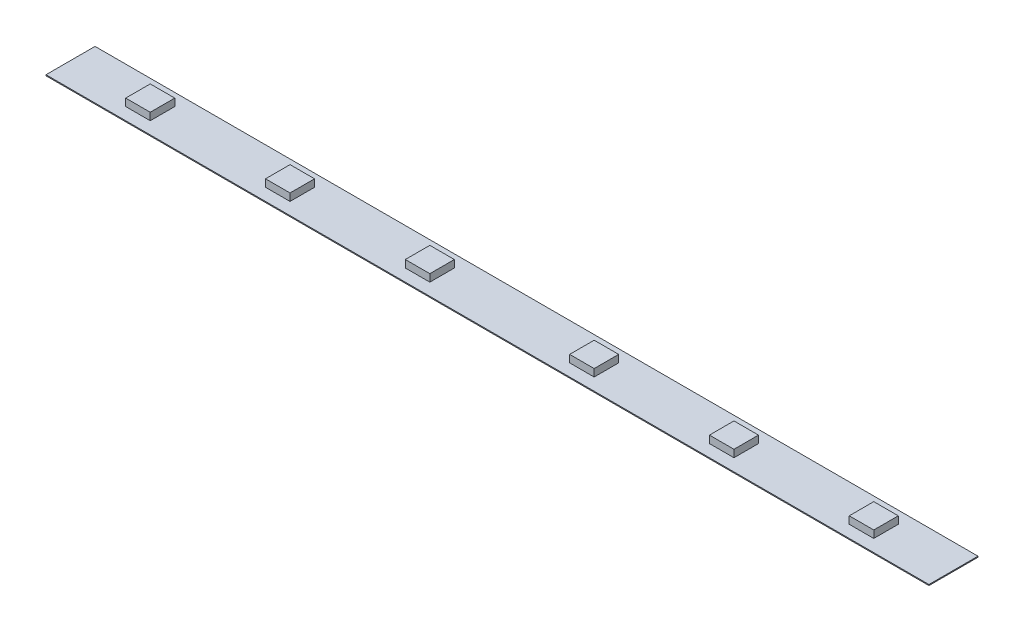
ISO-10303-21;
HEADER;
FILE_DESCRIPTION(('STEP AP214'),'2;1');
FILE_NAME('part.step','',(''),(''),'','','');
FILE_SCHEMA(('AUTOMOTIVE_DESIGN { 1 0 10303 214 1 1 1 1 }'));
ENDSEC;
DATA;
#1=APPLICATION_CONTEXT('core data for automotive mechanical design processes');
#2=APPLICATION_PROTOCOL_DEFINITION('international standard','automotive_design',2000,#1);
#3=PRODUCT_CONTEXT('',#1,'mechanical');
#4=PRODUCT('Part','Part','',(#3));
#5=PRODUCT_RELATED_PRODUCT_CATEGORY('part','',(#4));
#6=PRODUCT_DEFINITION_FORMATION('','',#4);
#7=PRODUCT_DEFINITION_CONTEXT('part definition',#1,'design');
#8=PRODUCT_DEFINITION('design','',#6,#7);
#9=PRODUCT_DEFINITION_SHAPE('','',#8);
#10=(LENGTH_UNIT() NAMED_UNIT(*) SI_UNIT(.MILLI.,.METRE.));
#11=(NAMED_UNIT(*) PLANE_ANGLE_UNIT() SI_UNIT($,.RADIAN.));
#12=(NAMED_UNIT(*) SI_UNIT($,.STERADIAN.) SOLID_ANGLE_UNIT());
#13=UNCERTAINTY_MEASURE_WITH_UNIT(LENGTH_MEASURE(1.E-05),#10,'distance_accuracy_value','');
#14=(GEOMETRIC_REPRESENTATION_CONTEXT(3) GLOBAL_UNCERTAINTY_ASSIGNED_CONTEXT((#13)) GLOBAL_UNIT_ASSIGNED_CONTEXT((#10,
#11,#12)) REPRESENTATION_CONTEXT('',''));
#15=CARTESIAN_POINT('',(0.,0.,0.));
#16=DIRECTION('',(0.,0.,1.));
#17=DIRECTION('',(1.,0.,0.));
#18=AXIS2_PLACEMENT_3D('',#15,#16,#17);
#19=CARTESIAN_POINT('',(0.,0.2,0.));
#20=DIRECTION('',(0.,-1.,0.));
#21=DIRECTION('',(0.,0.,-1.));
#22=AXIS2_PLACEMENT_3D('',#19,#20,#21);
#23=PLANE('',#22);
#24=DIRECTION('',(-1.,0.,0.));
#25=VECTOR('',#24,1.);
#26=CARTESIAN_POINT('',(-71.25,0.2,-2.5));
#27=LINE('',#26,#25);
#28=CARTESIAN_POINT('',(-71.25,0.2,-2.5));
#29=VERTEX_POINT('',#28);
#30=CARTESIAN_POINT('',(-76.25,0.2,-2.5));
#31=VERTEX_POINT('',#30);
#32=EDGE_CURVE('E240',#29,#31,#27,.T.);
#33=ORIENTED_EDGE('',*,*,#32,.F.);
#34=DIRECTION('',(0.,0.,-1.));
#35=VECTOR('',#34,1.);
#36=CARTESIAN_POINT('',(-71.25,0.2,-2.5));
#37=LINE('',#36,#35);
#38=CARTESIAN_POINT('',(-71.25,0.2,2.5));
#39=VERTEX_POINT('',#38);
#40=EDGE_CURVE('E253',#39,#29,#37,.T.);
#41=ORIENTED_EDGE('',*,*,#40,.F.);
#42=DIRECTION('',(1.,0.,0.));
#43=VECTOR('',#42,1.);
#44=CARTESIAN_POINT('',(-71.25,0.2,2.5));
#45=LINE('',#44,#43);
#46=CARTESIAN_POINT('',(-76.25,0.2,2.5));
#47=VERTEX_POINT('',#46);
#48=EDGE_CURVE('E262',#47,#39,#45,.T.);
#49=ORIENTED_EDGE('',*,*,#48,.F.);
#50=DIRECTION('',(0.,0.,1.));
#51=VECTOR('',#50,1.);
#52=CARTESIAN_POINT('',(-76.25,0.2,-2.5));
#53=LINE('',#52,#51);
#54=EDGE_CURVE('E243',#31,#47,#53,.T.);
#55=ORIENTED_EDGE('',*,*,#54,.F.);
#56=EDGE_LOOP('',(#33,#41,#49,#55));
#57=FACE_BOUND('',#56,.T.);
#58=DIRECTION('',(0.,0.,-1.));
#59=VECTOR('',#58,1.);
#60=CARTESIAN_POINT('',(76.25,0.2,-2.5));
#61=LINE('',#60,#59);
#62=CARTESIAN_POINT('',(76.25,0.2,2.5));
#63=VERTEX_POINT('',#62);
#64=CARTESIAN_POINT('',(76.25,0.2,-2.5));
#65=VERTEX_POINT('',#64);
#66=EDGE_CURVE('E311',#63,#65,#61,.T.);
#67=ORIENTED_EDGE('',*,*,#66,.F.);
#68=DIRECTION('',(1.,0.,0.));
#69=VECTOR('',#68,1.);
#70=CARTESIAN_POINT('',(71.25,0.2,2.5));
#71=LINE('',#70,#69);
#72=CARTESIAN_POINT('',(71.25,0.2,2.5));
#73=VERTEX_POINT('',#72);
#74=EDGE_CURVE('E316',#73,#63,#71,.T.);
#75=ORIENTED_EDGE('',*,*,#74,.F.);
#76=DIRECTION('',(0.,0.,1.));
#77=VECTOR('',#76,1.);
#78=CARTESIAN_POINT('',(71.25,0.2,-2.5));
#79=LINE('',#78,#77);
#80=CARTESIAN_POINT('',(71.25,0.2,-2.5));
#81=VERTEX_POINT('',#80);
#82=EDGE_CURVE('E328',#81,#73,#79,.T.);
#83=ORIENTED_EDGE('',*,*,#82,.F.);
#84=DIRECTION('',(-1.,0.,0.));
#85=VECTOR('',#84,1.);
#86=CARTESIAN_POINT('',(71.25,0.2,-2.5));
#87=LINE('',#86,#85);
#88=EDGE_CURVE('E325',#65,#81,#87,.T.);
#89=ORIENTED_EDGE('',*,*,#88,.F.);
#90=EDGE_LOOP('',(#67,#75,#83,#89));
#91=FACE_BOUND('',#90,.T.);
#92=DIRECTION('',(0.,0.,-1.));
#93=VECTOR('',#92,1.);
#94=CARTESIAN_POINT('',(19.25,0.2,-2.5));
#95=LINE('',#94,#93);
#96=CARTESIAN_POINT('',(19.25,0.2,2.5));
#97=VERTEX_POINT('',#96);
#98=CARTESIAN_POINT('',(19.25,0.2,-2.5));
#99=VERTEX_POINT('',#98);
#100=EDGE_CURVE('E377',#97,#99,#95,.T.);
#101=ORIENTED_EDGE('',*,*,#100,.F.);
#102=DIRECTION('',(1.,0.,0.));
#103=VECTOR('',#102,1.);
#104=CARTESIAN_POINT('',(14.25,0.2,2.5));
#105=LINE('',#104,#103);
#106=CARTESIAN_POINT('',(14.25,0.2,2.5));
#107=VERTEX_POINT('',#106);
#108=EDGE_CURVE('E382',#107,#97,#105,.T.);
#109=ORIENTED_EDGE('',*,*,#108,.F.);
#110=DIRECTION('',(0.,0.,1.));
#111=VECTOR('',#110,1.);
#112=CARTESIAN_POINT('',(14.25,0.2,-2.5));
#113=LINE('',#112,#111);
#114=CARTESIAN_POINT('',(14.25,0.2,-2.5));
#115=VERTEX_POINT('',#114);
#116=EDGE_CURVE('E394',#115,#107,#113,.T.);
#117=ORIENTED_EDGE('',*,*,#116,.F.);
#118=DIRECTION('',(-1.,0.,0.));
#119=VECTOR('',#118,1.);
#120=CARTESIAN_POINT('',(14.25,0.2,-2.5));
#121=LINE('',#120,#119);
#122=EDGE_CURVE('E391',#99,#115,#121,.T.);
#123=ORIENTED_EDGE('',*,*,#122,.F.);
#124=EDGE_LOOP('',(#101,#109,#117,#123));
#125=FACE_BOUND('',#124,.T.);
#126=DIRECTION('',(0.,0.,-1.));
#127=VECTOR('',#126,1.);
#128=CARTESIAN_POINT('',(90.,0.2,5.));
#129=LINE('',#128,#127);
#130=CARTESIAN_POINT('',(90.,0.2,5.));
#131=VERTEX_POINT('',#130);
#132=CARTESIAN_POINT('',(90.,0.2,-5.));
#133=VERTEX_POINT('',#132);
#134=EDGE_CURVE('E411',#131,#133,#129,.T.);
#135=ORIENTED_EDGE('',*,*,#134,.T.);
#136=DIRECTION('',(-1.,0.,0.));
#137=VECTOR('',#136,1.);
#138=CARTESIAN_POINT('',(-90.,0.2,-5.));
#139=LINE('',#138,#137);
#140=CARTESIAN_POINT('',(-90.,0.2,-5.));
#141=VERTEX_POINT('',#140);
#142=EDGE_CURVE('E414',#133,#141,#139,.T.);
#143=ORIENTED_EDGE('',*,*,#142,.T.);
#144=DIRECTION('',(0.,0.,1.));
#145=VECTOR('',#144,1.);
#146=CARTESIAN_POINT('',(-90.,0.2,5.));
#147=LINE('',#146,#145);
#148=CARTESIAN_POINT('',(-90.,0.2,5.));
#149=VERTEX_POINT('',#148);
#150=EDGE_CURVE('E417',#141,#149,#147,.T.);
#151=ORIENTED_EDGE('',*,*,#150,.T.);
#152=DIRECTION('',(1.,0.,0.));
#153=VECTOR('',#152,1.);
#154=CARTESIAN_POINT('',(-90.,0.2,5.));
#155=LINE('',#154,#153);
#156=EDGE_CURVE('E419',#149,#131,#155,.T.);
#157=ORIENTED_EDGE('',*,*,#156,.T.);
#158=EDGE_LOOP('',(#135,#143,#151,#157));
#159=FACE_BOUND('',#158,.T.);
#160=DIRECTION('',(0.,0.,-1.));
#161=VECTOR('',#160,1.);
#162=CARTESIAN_POINT('',(47.75,0.2,-2.5));
#163=LINE('',#162,#161);
#164=CARTESIAN_POINT('',(47.75,0.2,2.5));
#165=VERTEX_POINT('',#164);
#166=CARTESIAN_POINT('',(47.75,0.2,-2.5));
#167=VERTEX_POINT('',#166);
#168=EDGE_CURVE('E344',#165,#167,#163,.T.);
#169=ORIENTED_EDGE('',*,*,#168,.F.);
#170=DIRECTION('',(1.,0.,0.));
#171=VECTOR('',#170,1.);
#172=CARTESIAN_POINT('',(42.75,0.2,2.5));
#173=LINE('',#172,#171);
#174=CARTESIAN_POINT('',(42.75,0.2,2.5));
#175=VERTEX_POINT('',#174);
#176=EDGE_CURVE('E349',#175,#165,#173,.T.);
#177=ORIENTED_EDGE('',*,*,#176,.F.);
#178=DIRECTION('',(0.,0.,1.));
#179=VECTOR('',#178,1.);
#180=CARTESIAN_POINT('',(42.75,0.2,-2.5));
#181=LINE('',#180,#179);
#182=CARTESIAN_POINT('',(42.75,0.2,-2.5));
#183=VERTEX_POINT('',#182);
#184=EDGE_CURVE('E361',#183,#175,#181,.T.);
#185=ORIENTED_EDGE('',*,*,#184,.F.);
#186=DIRECTION('',(-1.,0.,0.));
#187=VECTOR('',#186,1.);
#188=CARTESIAN_POINT('',(42.75,0.2,-2.5));
#189=LINE('',#188,#187);
#190=EDGE_CURVE('E358',#167,#183,#189,.T.);
#191=ORIENTED_EDGE('',*,*,#190,.F.);
#192=EDGE_LOOP('',(#169,#177,#185,#191));
#193=FACE_BOUND('',#192,.T.);
#194=DIRECTION('',(0.,0.,-1.));
#195=VECTOR('',#194,1.);
#196=CARTESIAN_POINT('',(-14.25,0.2,-2.5));
#197=LINE('',#196,#195);
#198=CARTESIAN_POINT('',(-14.25,0.2,2.5));
#199=VERTEX_POINT('',#198);
#200=CARTESIAN_POINT('',(-14.25,0.2,-2.5));
#201=VERTEX_POINT('',#200);
#202=EDGE_CURVE('E278',#199,#201,#197,.T.);
#203=ORIENTED_EDGE('',*,*,#202,.F.);
#204=DIRECTION('',(1.,0.,0.));
#205=VECTOR('',#204,1.);
#206=CARTESIAN_POINT('',(-14.25,0.2,2.5));
#207=LINE('',#206,#205);
#208=CARTESIAN_POINT('',(-19.25,0.2,2.5));
#209=VERTEX_POINT('',#208);
#210=EDGE_CURVE('E283',#209,#199,#207,.T.);
#211=ORIENTED_EDGE('',*,*,#210,.F.);
#212=DIRECTION('',(0.,0.,1.));
#213=VECTOR('',#212,1.);
#214=CARTESIAN_POINT('',(-19.25,0.2,-2.5));
#215=LINE('',#214,#213);
#216=CARTESIAN_POINT('',(-19.25,0.2,-2.5));
#217=VERTEX_POINT('',#216);
#218=EDGE_CURVE('E295',#217,#209,#215,.T.);
#219=ORIENTED_EDGE('',*,*,#218,.F.);
#220=DIRECTION('',(-1.,0.,0.));
#221=VECTOR('',#220,1.);
#222=CARTESIAN_POINT('',(-14.25,0.2,-2.5));
#223=LINE('',#222,#221);
#224=EDGE_CURVE('E292',#201,#217,#223,.T.);
#225=ORIENTED_EDGE('',*,*,#224,.F.);
#226=EDGE_LOOP('',(#203,#211,#219,#225));
#227=FACE_BOUND('',#226,.T.);
#228=DIRECTION('',(-1.,0.,0.));
#229=VECTOR('',#228,1.);
#230=CARTESIAN_POINT('',(-42.75,0.2,-2.5));
#231=LINE('',#230,#229);
#232=CARTESIAN_POINT('',(-42.75,0.2,-2.5));
#233=VERTEX_POINT('',#232);
#234=CARTESIAN_POINT('',(-47.75,0.2,-2.5));
#235=VERTEX_POINT('',#234);
#236=EDGE_CURVE('E239',#233,#235,#231,.T.);
#237=ORIENTED_EDGE('',*,*,#236,.F.);
#238=DIRECTION('',(0.,0.,-1.));
#239=VECTOR('',#238,1.);
#240=CARTESIAN_POINT('',(-42.75,0.2,-2.5));
#241=LINE('',#240,#239);
#242=CARTESIAN_POINT('',(-42.75,0.2,2.5));
#243=VERTEX_POINT('',#242);
#244=EDGE_CURVE('E236',#243,#233,#241,.T.);
#245=ORIENTED_EDGE('',*,*,#244,.F.);
#246=DIRECTION('',(1.,0.,0.));
#247=VECTOR('',#246,1.);
#248=CARTESIAN_POINT('',(-42.75,0.2,2.5));
#249=LINE('',#248,#247);
#250=CARTESIAN_POINT('',(-47.75,0.2,2.5));
#251=VERTEX_POINT('',#250);
#252=EDGE_CURVE('E54',#251,#243,#249,.T.);
#253=ORIENTED_EDGE('',*,*,#252,.F.);
#254=DIRECTION('',(0.,0.,1.));
#255=VECTOR('',#254,1.);
#256=CARTESIAN_POINT('',(-47.75,0.2,-2.5));
#257=LINE('',#256,#255);
#258=EDGE_CURVE('E49',#235,#251,#257,.T.);
#259=ORIENTED_EDGE('',*,*,#258,.F.);
#260=EDGE_LOOP('',(#237,#245,#253,#259));
#261=FACE_BOUND('',#260,.T.);
#262=ADVANCED_FACE('F34',(#57,#91,#125,#159,#193,#227,#261),#23,.F.);
#263=CARTESIAN_POINT('',(90.,0.2,5.));
#264=DIRECTION('',(-1.,0.,0.));
#265=DIRECTION('',(0.,0.,1.));
#266=AXIS2_PLACEMENT_3D('',#263,#264,#265);
#267=PLANE('',#266);
#268=DIRECTION('',(0.,0.,-1.));
#269=VECTOR('',#268,1.);
#270=CARTESIAN_POINT('',(90.,0.,5.));
#271=LINE('',#270,#269);
#272=CARTESIAN_POINT('',(90.,0.,5.));
#273=VERTEX_POINT('',#272);
#274=CARTESIAN_POINT('',(90.,0.,-5.));
#275=VERTEX_POINT('',#274);
#276=EDGE_CURVE('E410',#273,#275,#271,.T.);
#277=ORIENTED_EDGE('',*,*,#276,.T.);
#278=DIRECTION('',(0.,-1.,0.));
#279=VECTOR('',#278,1.);
#280=CARTESIAN_POINT('',(90.,0.2,-5.));
#281=LINE('',#280,#279);
#282=EDGE_CURVE('E11',#133,#275,#281,.T.);
#283=ORIENTED_EDGE('',*,*,#282,.F.);
#284=ORIENTED_EDGE('',*,*,#134,.F.);
#285=DIRECTION('',(0.,-1.,0.));
#286=VECTOR('',#285,1.);
#287=CARTESIAN_POINT('',(90.,0.2,5.));
#288=LINE('',#287,#286);
#289=EDGE_CURVE('E421',#131,#273,#288,.T.);
#290=ORIENTED_EDGE('',*,*,#289,.T.);
#291=EDGE_LOOP('',(#277,#283,#284,#290));
#292=FACE_BOUND('',#291,.T.);
#293=ADVANCED_FACE('F36',(#292),#267,.F.);
#294=CARTESIAN_POINT('',(-90.,0.2,-5.));
#295=DIRECTION('',(0.,0.,1.));
#296=DIRECTION('',(1.,0.,0.));
#297=AXIS2_PLACEMENT_3D('',#294,#295,#296);
#298=PLANE('',#297);
#299=DIRECTION('',(-1.,0.,0.));
#300=VECTOR('',#299,1.);
#301=CARTESIAN_POINT('',(-90.,0.,-5.));
#302=LINE('',#301,#300);
#303=CARTESIAN_POINT('',(-90.,0.,-5.));
#304=VERTEX_POINT('',#303);
#305=EDGE_CURVE('E424',#275,#304,#302,.T.);
#306=ORIENTED_EDGE('',*,*,#305,.T.);
#307=DIRECTION('',(0.,-1.,0.));
#308=VECTOR('',#307,1.);
#309=CARTESIAN_POINT('',(-90.,0.2,-5.));
#310=LINE('',#309,#308);
#311=EDGE_CURVE('E42',#141,#304,#310,.T.);
#312=ORIENTED_EDGE('',*,*,#311,.F.);
#313=ORIENTED_EDGE('',*,*,#142,.F.);
#314=ORIENTED_EDGE('',*,*,#282,.T.);
#315=EDGE_LOOP('',(#306,#312,#313,#314));
#316=FACE_BOUND('',#315,.T.);
#317=ADVANCED_FACE('F454',(#316),#298,.F.);
#318=CARTESIAN_POINT('',(-90.,0.2,5.));
#319=DIRECTION('',(1.,0.,0.));
#320=DIRECTION('',(0.,0.,-1.));
#321=AXIS2_PLACEMENT_3D('',#318,#319,#320);
#322=PLANE('',#321);
#323=DIRECTION('',(0.,0.,1.));
#324=VECTOR('',#323,1.);
#325=CARTESIAN_POINT('',(-90.,0.,5.));
#326=LINE('',#325,#324);
#327=CARTESIAN_POINT('',(-90.,0.,5.));
#328=VERTEX_POINT('',#327);
#329=EDGE_CURVE('E426',#304,#328,#326,.T.);
#330=ORIENTED_EDGE('',*,*,#329,.T.);
#331=DIRECTION('',(0.,-1.,0.));
#332=VECTOR('',#331,1.);
#333=CARTESIAN_POINT('',(-90.,0.2,5.));
#334=LINE('',#333,#332);
#335=EDGE_CURVE('E431',#149,#328,#334,.T.);
#336=ORIENTED_EDGE('',*,*,#335,.F.);
#337=ORIENTED_EDGE('',*,*,#150,.F.);
#338=ORIENTED_EDGE('',*,*,#311,.T.);
#339=EDGE_LOOP('',(#330,#336,#337,#338));
#340=FACE_BOUND('',#339,.T.);
#341=ADVANCED_FACE('F438',(#340),#322,.F.);
#342=CARTESIAN_POINT('',(-90.,0.2,5.));
#343=DIRECTION('',(0.,0.,-1.));
#344=DIRECTION('',(-1.,0.,0.));
#345=AXIS2_PLACEMENT_3D('',#342,#343,#344);
#346=PLANE('',#345);
#347=DIRECTION('',(1.,0.,0.));
#348=VECTOR('',#347,1.);
#349=CARTESIAN_POINT('',(-90.,0.,5.));
#350=LINE('',#349,#348);
#351=EDGE_CURVE('E415',#328,#273,#350,.T.);
#352=ORIENTED_EDGE('',*,*,#351,.T.);
#353=ORIENTED_EDGE('',*,*,#289,.F.);
#354=ORIENTED_EDGE('',*,*,#156,.F.);
#355=ORIENTED_EDGE('',*,*,#335,.T.);
#356=EDGE_LOOP('',(#352,#353,#354,#355));
#357=FACE_BOUND('',#356,.T.);
#358=ADVANCED_FACE('F447',(#357),#346,.F.);
#359=CARTESIAN_POINT('',(0.,0.,0.));
#360=DIRECTION('',(0.,-1.,0.));
#361=DIRECTION('',(0.,0.,-1.));
#362=AXIS2_PLACEMENT_3D('',#359,#360,#361);
#363=PLANE('',#362);
#364=ORIENTED_EDGE('',*,*,#276,.F.);
#365=ORIENTED_EDGE('',*,*,#351,.F.);
#366=ORIENTED_EDGE('',*,*,#329,.F.);
#367=ORIENTED_EDGE('',*,*,#305,.F.);
#368=EDGE_LOOP('',(#364,#365,#366,#367));
#369=FACE_BOUND('',#368,.T.);
#370=ADVANCED_FACE('F444',(#369),#363,.T.);
#371=CARTESIAN_POINT('',(19.25,1.7,-2.5));
#372=DIRECTION('',(-1.,0.,0.));
#373=DIRECTION('',(0.,0.,1.));
#374=AXIS2_PLACEMENT_3D('',#371,#372,#373);
#375=PLANE('',#374);
#376=ORIENTED_EDGE('',*,*,#100,.T.);
#377=DIRECTION('',(0.,-1.,0.));
#378=VECTOR('',#377,1.);
#379=CARTESIAN_POINT('',(19.25,1.7,-2.5));
#380=LINE('',#379,#378);
#381=CARTESIAN_POINT('',(19.25,1.7,-2.5));
#382=VERTEX_POINT('',#381);
#383=EDGE_CURVE('E407',#382,#99,#380,.T.);
#384=ORIENTED_EDGE('',*,*,#383,.F.);
#385=DIRECTION('',(0.,0.,-1.));
#386=VECTOR('',#385,1.);
#387=CARTESIAN_POINT('',(19.25,1.7,-2.5));
#388=LINE('',#387,#386);
#389=CARTESIAN_POINT('',(19.25,1.7,2.5));
#390=VERTEX_POINT('',#389);
#391=EDGE_CURVE('E378',#390,#382,#388,.T.);
#392=ORIENTED_EDGE('',*,*,#391,.F.);
#393=DIRECTION('',(0.,-1.,0.));
#394=VECTOR('',#393,1.);
#395=CARTESIAN_POINT('',(19.25,1.7,2.5));
#396=LINE('',#395,#394);
#397=EDGE_CURVE('E388',#390,#97,#396,.T.);
#398=ORIENTED_EDGE('',*,*,#397,.T.);
#399=EDGE_LOOP('',(#376,#384,#392,#398));
#400=FACE_BOUND('',#399,.T.);
#401=ADVANCED_FACE('F469',(#400),#375,.F.);
#402=CARTESIAN_POINT('',(14.25,1.7,-2.5));
#403=DIRECTION('',(0.,0.,1.));
#404=DIRECTION('',(1.,0.,0.));
#405=AXIS2_PLACEMENT_3D('',#402,#403,#404);
#406=PLANE('',#405);
#407=ORIENTED_EDGE('',*,*,#122,.T.);
#408=DIRECTION('',(0.,-1.,0.));
#409=VECTOR('',#408,1.);
#410=CARTESIAN_POINT('',(14.25,1.7,-2.5));
#411=LINE('',#410,#409);
#412=CARTESIAN_POINT('',(14.25,1.7,-2.5));
#413=VERTEX_POINT('',#412);
#414=EDGE_CURVE('E404',#413,#115,#411,.T.);
#415=ORIENTED_EDGE('',*,*,#414,.F.);
#416=DIRECTION('',(-1.,0.,0.));
#417=VECTOR('',#416,1.);
#418=CARTESIAN_POINT('',(14.25,1.7,-2.5));
#419=LINE('',#418,#417);
#420=EDGE_CURVE('E381',#382,#413,#419,.T.);
#421=ORIENTED_EDGE('',*,*,#420,.F.);
#422=ORIENTED_EDGE('',*,*,#383,.T.);
#423=EDGE_LOOP('',(#407,#415,#421,#422));
#424=FACE_BOUND('',#423,.T.);
#425=ADVANCED_FACE('F488',(#424),#406,.F.);
#426=CARTESIAN_POINT('',(14.25,1.7,-2.5));
#427=DIRECTION('',(1.,0.,0.));
#428=DIRECTION('',(0.,0.,-1.));
#429=AXIS2_PLACEMENT_3D('',#426,#427,#428);
#430=PLANE('',#429);
#431=ORIENTED_EDGE('',*,*,#116,.T.);
#432=DIRECTION('',(0.,-1.,0.));
#433=VECTOR('',#432,1.);
#434=CARTESIAN_POINT('',(14.25,1.7,2.5));
#435=LINE('',#434,#433);
#436=CARTESIAN_POINT('',(14.25,1.7,2.5));
#437=VERTEX_POINT('',#436);
#438=EDGE_CURVE('E401',#437,#107,#435,.T.);
#439=ORIENTED_EDGE('',*,*,#438,.F.);
#440=DIRECTION('',(0.,0.,1.));
#441=VECTOR('',#440,1.);
#442=CARTESIAN_POINT('',(14.25,1.7,-2.5));
#443=LINE('',#442,#441);
#444=EDGE_CURVE('E384',#413,#437,#443,.T.);
#445=ORIENTED_EDGE('',*,*,#444,.F.);
#446=ORIENTED_EDGE('',*,*,#414,.T.);
#447=EDGE_LOOP('',(#431,#439,#445,#446));
#448=FACE_BOUND('',#447,.T.);
#449=ADVANCED_FACE('F495',(#448),#430,.F.);
#450=CARTESIAN_POINT('',(14.25,1.7,2.5));
#451=DIRECTION('',(0.,0.,-1.));
#452=DIRECTION('',(-1.,0.,0.));
#453=AXIS2_PLACEMENT_3D('',#450,#451,#452);
#454=PLANE('',#453);
#455=ORIENTED_EDGE('',*,*,#108,.T.);
#456=ORIENTED_EDGE('',*,*,#397,.F.);
#457=DIRECTION('',(1.,0.,0.));
#458=VECTOR('',#457,1.);
#459=CARTESIAN_POINT('',(14.25,1.7,2.5));
#460=LINE('',#459,#458);
#461=EDGE_CURVE('E386',#437,#390,#460,.T.);
#462=ORIENTED_EDGE('',*,*,#461,.F.);
#463=ORIENTED_EDGE('',*,*,#438,.T.);
#464=EDGE_LOOP('',(#455,#456,#462,#463));
#465=FACE_BOUND('',#464,.T.);
#466=ADVANCED_FACE('F502',(#465),#454,.F.);
#467=CARTESIAN_POINT('',(0.,1.7,0.));
#468=DIRECTION('',(0.,1.,0.));
#469=DIRECTION('',(0.,0.,1.));
#470=AXIS2_PLACEMENT_3D('',#467,#468,#469);
#471=PLANE('',#470);
#472=ORIENTED_EDGE('',*,*,#391,.T.);
#473=ORIENTED_EDGE('',*,*,#420,.T.);
#474=ORIENTED_EDGE('',*,*,#444,.T.);
#475=ORIENTED_EDGE('',*,*,#461,.T.);
#476=EDGE_LOOP('',(#472,#473,#474,#475));
#477=FACE_BOUND('',#476,.T.);
#478=ADVANCED_FACE('F510',(#477),#471,.T.);
#479=CARTESIAN_POINT('',(47.75,1.7,-2.5));
#480=DIRECTION('',(-1.,0.,0.));
#481=DIRECTION('',(0.,0.,1.));
#482=AXIS2_PLACEMENT_3D('',#479,#480,#481);
#483=PLANE('',#482);
#484=ORIENTED_EDGE('',*,*,#168,.T.);
#485=DIRECTION('',(0.,-1.,0.));
#486=VECTOR('',#485,1.);
#487=CARTESIAN_POINT('',(47.75,1.7,-2.5));
#488=LINE('',#487,#486);
#489=CARTESIAN_POINT('',(47.75,1.7,-2.5));
#490=VERTEX_POINT('',#489);
#491=EDGE_CURVE('E374',#490,#167,#488,.T.);
#492=ORIENTED_EDGE('',*,*,#491,.F.);
#493=DIRECTION('',(0.,0.,-1.));
#494=VECTOR('',#493,1.);
#495=CARTESIAN_POINT('',(47.75,1.7,-2.5));
#496=LINE('',#495,#494);
#497=CARTESIAN_POINT('',(47.75,1.7,2.5));
#498=VERTEX_POINT('',#497);
#499=EDGE_CURVE('E345',#498,#490,#496,.T.);
#500=ORIENTED_EDGE('',*,*,#499,.F.);
#501=DIRECTION('',(0.,-1.,0.));
#502=VECTOR('',#501,1.);
#503=CARTESIAN_POINT('',(47.75,1.7,2.5));
#504=LINE('',#503,#502);
#505=EDGE_CURVE('E355',#498,#165,#504,.T.);
#506=ORIENTED_EDGE('',*,*,#505,.T.);
#507=EDGE_LOOP('',(#484,#492,#500,#506));
#508=FACE_BOUND('',#507,.T.);
#509=ADVANCED_FACE('F518',(#508),#483,.F.);
#510=CARTESIAN_POINT('',(42.75,1.7,-2.5));
#511=DIRECTION('',(0.,0.,1.));
#512=DIRECTION('',(1.,0.,0.));
#513=AXIS2_PLACEMENT_3D('',#510,#511,#512);
#514=PLANE('',#513);
#515=ORIENTED_EDGE('',*,*,#190,.T.);
#516=DIRECTION('',(0.,-1.,0.));
#517=VECTOR('',#516,1.);
#518=CARTESIAN_POINT('',(42.75,1.7,-2.5));
#519=LINE('',#518,#517);
#520=CARTESIAN_POINT('',(42.75,1.7,-2.5));
#521=VERTEX_POINT('',#520);
#522=EDGE_CURVE('E371',#521,#183,#519,.T.);
#523=ORIENTED_EDGE('',*,*,#522,.F.);
#524=DIRECTION('',(-1.,0.,0.));
#525=VECTOR('',#524,1.);
#526=CARTESIAN_POINT('',(42.75,1.7,-2.5));
#527=LINE('',#526,#525);
#528=EDGE_CURVE('E348',#490,#521,#527,.T.);
#529=ORIENTED_EDGE('',*,*,#528,.F.);
#530=ORIENTED_EDGE('',*,*,#491,.T.);
#531=EDGE_LOOP('',(#515,#523,#529,#530));
#532=FACE_BOUND('',#531,.T.);
#533=ADVANCED_FACE('F526',(#532),#514,.F.);
#534=CARTESIAN_POINT('',(42.75,1.7,-2.5));
#535=DIRECTION('',(1.,0.,0.));
#536=DIRECTION('',(0.,0.,-1.));
#537=AXIS2_PLACEMENT_3D('',#534,#535,#536);
#538=PLANE('',#537);
#539=ORIENTED_EDGE('',*,*,#184,.T.);
#540=DIRECTION('',(0.,-1.,0.));
#541=VECTOR('',#540,1.);
#542=CARTESIAN_POINT('',(42.75,1.7,2.5));
#543=LINE('',#542,#541);
#544=CARTESIAN_POINT('',(42.75,1.7,2.5));
#545=VERTEX_POINT('',#544);
#546=EDGE_CURVE('E368',#545,#175,#543,.T.);
#547=ORIENTED_EDGE('',*,*,#546,.F.);
#548=DIRECTION('',(0.,0.,1.));
#549=VECTOR('',#548,1.);
#550=CARTESIAN_POINT('',(42.75,1.7,-2.5));
#551=LINE('',#550,#549);
#552=EDGE_CURVE('E351',#521,#545,#551,.T.);
#553=ORIENTED_EDGE('',*,*,#552,.F.);
#554=ORIENTED_EDGE('',*,*,#522,.T.);
#555=EDGE_LOOP('',(#539,#547,#553,#554));
#556=FACE_BOUND('',#555,.T.);
#557=ADVANCED_FACE('F534',(#556),#538,.F.);
#558=CARTESIAN_POINT('',(42.75,1.7,2.5));
#559=DIRECTION('',(0.,0.,-1.));
#560=DIRECTION('',(-1.,0.,0.));
#561=AXIS2_PLACEMENT_3D('',#558,#559,#560);
#562=PLANE('',#561);
#563=ORIENTED_EDGE('',*,*,#176,.T.);
#564=ORIENTED_EDGE('',*,*,#505,.F.);
#565=DIRECTION('',(1.,0.,0.));
#566=VECTOR('',#565,1.);
#567=CARTESIAN_POINT('',(42.75,1.7,2.5));
#568=LINE('',#567,#566);
#569=EDGE_CURVE('E353',#545,#498,#568,.T.);
#570=ORIENTED_EDGE('',*,*,#569,.F.);
#571=ORIENTED_EDGE('',*,*,#546,.T.);
#572=EDGE_LOOP('',(#563,#564,#570,#571));
#573=FACE_BOUND('',#572,.T.);
#574=ADVANCED_FACE('F542',(#573),#562,.F.);
#575=CARTESIAN_POINT('',(0.,1.7,0.));
#576=DIRECTION('',(0.,1.,0.));
#577=DIRECTION('',(0.,0.,1.));
#578=AXIS2_PLACEMENT_3D('',#575,#576,#577);
#579=PLANE('',#578);
#580=ORIENTED_EDGE('',*,*,#499,.T.);
#581=ORIENTED_EDGE('',*,*,#528,.T.);
#582=ORIENTED_EDGE('',*,*,#552,.T.);
#583=ORIENTED_EDGE('',*,*,#569,.T.);
#584=EDGE_LOOP('',(#580,#581,#582,#583));
#585=FACE_BOUND('',#584,.T.);
#586=ADVANCED_FACE('F550',(#585),#579,.T.);
#587=CARTESIAN_POINT('',(76.25,1.7,-2.5));
#588=DIRECTION('',(-1.,0.,0.));
#589=DIRECTION('',(0.,0.,1.));
#590=AXIS2_PLACEMENT_3D('',#587,#588,#589);
#591=PLANE('',#590);
#592=ORIENTED_EDGE('',*,*,#66,.T.);
#593=DIRECTION('',(0.,-1.,0.));
#594=VECTOR('',#593,1.);
#595=CARTESIAN_POINT('',(76.25,1.7,-2.5));
#596=LINE('',#595,#594);
#597=CARTESIAN_POINT('',(76.25,1.7,-2.5));
#598=VERTEX_POINT('',#597);
#599=EDGE_CURVE('E341',#598,#65,#596,.T.);
#600=ORIENTED_EDGE('',*,*,#599,.F.);
#601=DIRECTION('',(0.,0.,-1.));
#602=VECTOR('',#601,1.);
#603=CARTESIAN_POINT('',(76.25,1.7,-2.5));
#604=LINE('',#603,#602);
#605=CARTESIAN_POINT('',(76.25,1.7,2.5));
#606=VERTEX_POINT('',#605);
#607=EDGE_CURVE('E312',#606,#598,#604,.T.);
#608=ORIENTED_EDGE('',*,*,#607,.F.);
#609=DIRECTION('',(0.,-1.,0.));
#610=VECTOR('',#609,1.);
#611=CARTESIAN_POINT('',(76.25,1.7,2.5));
#612=LINE('',#611,#610);
#613=EDGE_CURVE('E322',#606,#63,#612,.T.);
#614=ORIENTED_EDGE('',*,*,#613,.T.);
#615=EDGE_LOOP('',(#592,#600,#608,#614));
#616=FACE_BOUND('',#615,.T.);
#617=ADVANCED_FACE('F558',(#616),#591,.F.);
#618=CARTESIAN_POINT('',(71.25,1.7,-2.5));
#619=DIRECTION('',(0.,0.,1.));
#620=DIRECTION('',(1.,0.,0.));
#621=AXIS2_PLACEMENT_3D('',#618,#619,#620);
#622=PLANE('',#621);
#623=ORIENTED_EDGE('',*,*,#88,.T.);
#624=DIRECTION('',(0.,-1.,0.));
#625=VECTOR('',#624,1.);
#626=CARTESIAN_POINT('',(71.25,1.7,-2.5));
#627=LINE('',#626,#625);
#628=CARTESIAN_POINT('',(71.25,1.7,-2.5));
#629=VERTEX_POINT('',#628);
#630=EDGE_CURVE('E338',#629,#81,#627,.T.);
#631=ORIENTED_EDGE('',*,*,#630,.F.);
#632=DIRECTION('',(-1.,0.,0.));
#633=VECTOR('',#632,1.);
#634=CARTESIAN_POINT('',(71.25,1.7,-2.5));
#635=LINE('',#634,#633);
#636=EDGE_CURVE('E315',#598,#629,#635,.T.);
#637=ORIENTED_EDGE('',*,*,#636,.F.);
#638=ORIENTED_EDGE('',*,*,#599,.T.);
#639=EDGE_LOOP('',(#623,#631,#637,#638));
#640=FACE_BOUND('',#639,.T.);
#641=ADVANCED_FACE('F566',(#640),#622,.F.);
#642=CARTESIAN_POINT('',(71.25,1.7,-2.5));
#643=DIRECTION('',(1.,0.,0.));
#644=DIRECTION('',(0.,0.,-1.));
#645=AXIS2_PLACEMENT_3D('',#642,#643,#644);
#646=PLANE('',#645);
#647=ORIENTED_EDGE('',*,*,#82,.T.);
#648=DIRECTION('',(0.,-1.,0.));
#649=VECTOR('',#648,1.);
#650=CARTESIAN_POINT('',(71.25,1.7,2.5));
#651=LINE('',#650,#649);
#652=CARTESIAN_POINT('',(71.25,1.7,2.5));
#653=VERTEX_POINT('',#652);
#654=EDGE_CURVE('E335',#653,#73,#651,.T.);
#655=ORIENTED_EDGE('',*,*,#654,.F.);
#656=DIRECTION('',(0.,0.,1.));
#657=VECTOR('',#656,1.);
#658=CARTESIAN_POINT('',(71.25,1.7,-2.5));
#659=LINE('',#658,#657);
#660=EDGE_CURVE('E318',#629,#653,#659,.T.);
#661=ORIENTED_EDGE('',*,*,#660,.F.);
#662=ORIENTED_EDGE('',*,*,#630,.T.);
#663=EDGE_LOOP('',(#647,#655,#661,#662));
#664=FACE_BOUND('',#663,.T.);
#665=ADVANCED_FACE('F574',(#664),#646,.F.);
#666=CARTESIAN_POINT('',(71.25,1.7,2.5));
#667=DIRECTION('',(0.,0.,-1.));
#668=DIRECTION('',(-1.,0.,0.));
#669=AXIS2_PLACEMENT_3D('',#666,#667,#668);
#670=PLANE('',#669);
#671=ORIENTED_EDGE('',*,*,#74,.T.);
#672=ORIENTED_EDGE('',*,*,#613,.F.);
#673=DIRECTION('',(1.,0.,0.));
#674=VECTOR('',#673,1.);
#675=CARTESIAN_POINT('',(71.25,1.7,2.5));
#676=LINE('',#675,#674);
#677=EDGE_CURVE('E320',#653,#606,#676,.T.);
#678=ORIENTED_EDGE('',*,*,#677,.F.);
#679=ORIENTED_EDGE('',*,*,#654,.T.);
#680=EDGE_LOOP('',(#671,#672,#678,#679));
#681=FACE_BOUND('',#680,.T.);
#682=ADVANCED_FACE('F582',(#681),#670,.F.);
#683=CARTESIAN_POINT('',(0.,1.7,0.));
#684=DIRECTION('',(0.,1.,0.));
#685=DIRECTION('',(0.,0.,1.));
#686=AXIS2_PLACEMENT_3D('',#683,#684,#685);
#687=PLANE('',#686);
#688=ORIENTED_EDGE('',*,*,#607,.T.);
#689=ORIENTED_EDGE('',*,*,#636,.T.);
#690=ORIENTED_EDGE('',*,*,#660,.T.);
#691=ORIENTED_EDGE('',*,*,#677,.T.);
#692=EDGE_LOOP('',(#688,#689,#690,#691));
#693=FACE_BOUND('',#692,.T.);
#694=ADVANCED_FACE('F590',(#693),#687,.T.);
#695=CARTESIAN_POINT('',(-14.25,1.7,-2.5));
#696=DIRECTION('',(-1.,0.,0.));
#697=DIRECTION('',(0.,0.,1.));
#698=AXIS2_PLACEMENT_3D('',#695,#696,#697);
#699=PLANE('',#698);
#700=ORIENTED_EDGE('',*,*,#202,.T.);
#701=DIRECTION('',(0.,-1.,0.));
#702=VECTOR('',#701,1.);
#703=CARTESIAN_POINT('',(-14.25,1.7,-2.5));
#704=LINE('',#703,#702);
#705=CARTESIAN_POINT('',(-14.25,1.7,-2.5));
#706=VERTEX_POINT('',#705);
#707=EDGE_CURVE('E308',#706,#201,#704,.T.);
#708=ORIENTED_EDGE('',*,*,#707,.F.);
#709=DIRECTION('',(0.,0.,-1.));
#710=VECTOR('',#709,1.);
#711=CARTESIAN_POINT('',(-14.25,1.7,-2.5));
#712=LINE('',#711,#710);
#713=CARTESIAN_POINT('',(-14.25,1.7,2.5));
#714=VERTEX_POINT('',#713);
#715=EDGE_CURVE('E279',#714,#706,#712,.T.);
#716=ORIENTED_EDGE('',*,*,#715,.F.);
#717=DIRECTION('',(0.,-1.,0.));
#718=VECTOR('',#717,1.);
#719=CARTESIAN_POINT('',(-14.25,1.7,2.5));
#720=LINE('',#719,#718);
#721=EDGE_CURVE('E289',#714,#199,#720,.T.);
#722=ORIENTED_EDGE('',*,*,#721,.T.);
#723=EDGE_LOOP('',(#700,#708,#716,#722));
#724=FACE_BOUND('',#723,.T.);
#725=ADVANCED_FACE('F598',(#724),#699,.F.);
#726=CARTESIAN_POINT('',(-14.25,1.7,-2.5));
#727=DIRECTION('',(0.,0.,1.));
#728=DIRECTION('',(1.,0.,0.));
#729=AXIS2_PLACEMENT_3D('',#726,#727,#728);
#730=PLANE('',#729);
#731=ORIENTED_EDGE('',*,*,#224,.T.);
#732=DIRECTION('',(0.,-1.,0.));
#733=VECTOR('',#732,1.);
#734=CARTESIAN_POINT('',(-19.25,1.7,-2.5));
#735=LINE('',#734,#733);
#736=CARTESIAN_POINT('',(-19.25,1.7,-2.5));
#737=VERTEX_POINT('',#736);
#738=EDGE_CURVE('E305',#737,#217,#735,.T.);
#739=ORIENTED_EDGE('',*,*,#738,.F.);
#740=DIRECTION('',(-1.,0.,0.));
#741=VECTOR('',#740,1.);
#742=CARTESIAN_POINT('',(-14.25,1.7,-2.5));
#743=LINE('',#742,#741);
#744=EDGE_CURVE('E282',#706,#737,#743,.T.);
#745=ORIENTED_EDGE('',*,*,#744,.F.);
#746=ORIENTED_EDGE('',*,*,#707,.T.);
#747=EDGE_LOOP('',(#731,#739,#745,#746));
#748=FACE_BOUND('',#747,.T.);
#749=ADVANCED_FACE('F606',(#748),#730,.F.);
#750=CARTESIAN_POINT('',(-19.25,1.7,-2.5));
#751=DIRECTION('',(1.,0.,0.));
#752=DIRECTION('',(0.,0.,-1.));
#753=AXIS2_PLACEMENT_3D('',#750,#751,#752);
#754=PLANE('',#753);
#755=ORIENTED_EDGE('',*,*,#218,.T.);
#756=DIRECTION('',(0.,-1.,0.));
#757=VECTOR('',#756,1.);
#758=CARTESIAN_POINT('',(-19.25,1.7,2.5));
#759=LINE('',#758,#757);
#760=CARTESIAN_POINT('',(-19.25,1.7,2.5));
#761=VERTEX_POINT('',#760);
#762=EDGE_CURVE('E302',#761,#209,#759,.T.);
#763=ORIENTED_EDGE('',*,*,#762,.F.);
#764=DIRECTION('',(0.,0.,1.));
#765=VECTOR('',#764,1.);
#766=CARTESIAN_POINT('',(-19.25,1.7,-2.5));
#767=LINE('',#766,#765);
#768=EDGE_CURVE('E285',#737,#761,#767,.T.);
#769=ORIENTED_EDGE('',*,*,#768,.F.);
#770=ORIENTED_EDGE('',*,*,#738,.T.);
#771=EDGE_LOOP('',(#755,#763,#769,#770));
#772=FACE_BOUND('',#771,.T.);
#773=ADVANCED_FACE('F614',(#772),#754,.F.);
#774=CARTESIAN_POINT('',(-14.25,1.7,2.5));
#775=DIRECTION('',(0.,0.,-1.));
#776=DIRECTION('',(-1.,0.,0.));
#777=AXIS2_PLACEMENT_3D('',#774,#775,#776);
#778=PLANE('',#777);
#779=ORIENTED_EDGE('',*,*,#210,.T.);
#780=ORIENTED_EDGE('',*,*,#721,.F.);
#781=DIRECTION('',(1.,0.,0.));
#782=VECTOR('',#781,1.);
#783=CARTESIAN_POINT('',(-14.25,1.7,2.5));
#784=LINE('',#783,#782);
#785=EDGE_CURVE('E287',#761,#714,#784,.T.);
#786=ORIENTED_EDGE('',*,*,#785,.F.);
#787=ORIENTED_EDGE('',*,*,#762,.T.);
#788=EDGE_LOOP('',(#779,#780,#786,#787));
#789=FACE_BOUND('',#788,.T.);
#790=ADVANCED_FACE('F622',(#789),#778,.F.);
#791=CARTESIAN_POINT('',(0.,1.7,0.));
#792=DIRECTION('',(0.,-1.,0.));
#793=DIRECTION('',(0.,0.,-1.));
#794=AXIS2_PLACEMENT_3D('',#791,#792,#793);
#795=PLANE('',#794);
#796=ORIENTED_EDGE('',*,*,#715,.T.);
#797=ORIENTED_EDGE('',*,*,#744,.T.);
#798=ORIENTED_EDGE('',*,*,#768,.T.);
#799=ORIENTED_EDGE('',*,*,#785,.T.);
#800=EDGE_LOOP('',(#796,#797,#798,#799));
#801=FACE_BOUND('',#800,.T.);
#802=ADVANCED_FACE('F630',(#801),#795,.F.);
#803=CARTESIAN_POINT('',(-71.25,1.7,-2.5));
#804=DIRECTION('',(0.,0.,1.));
#805=DIRECTION('',(1.,0.,0.));
#806=AXIS2_PLACEMENT_3D('',#803,#804,#805);
#807=PLANE('',#806);
#808=ORIENTED_EDGE('',*,*,#32,.T.);
#809=DIRECTION('',(0.,-1.,0.));
#810=VECTOR('',#809,1.);
#811=CARTESIAN_POINT('',(-76.25,1.7,-2.5));
#812=LINE('',#811,#810);
#813=CARTESIAN_POINT('',(-76.25,1.7,-2.5));
#814=VERTEX_POINT('',#813);
#815=EDGE_CURVE('E275',#814,#31,#812,.T.);
#816=ORIENTED_EDGE('',*,*,#815,.F.);
#817=DIRECTION('',(-1.,0.,0.));
#818=VECTOR('',#817,1.);
#819=CARTESIAN_POINT('',(-71.25,1.7,-2.5));
#820=LINE('',#819,#818);
#821=CARTESIAN_POINT('',(-71.25,1.7,-2.5));
#822=VERTEX_POINT('',#821);
#823=EDGE_CURVE('E249',#822,#814,#820,.T.);
#824=ORIENTED_EDGE('',*,*,#823,.F.);
#825=DIRECTION('',(0.,-1.,0.));
#826=VECTOR('',#825,1.);
#827=CARTESIAN_POINT('',(-71.25,1.7,-2.5));
#828=LINE('',#827,#826);
#829=EDGE_CURVE('E258',#822,#29,#828,.T.);
#830=ORIENTED_EDGE('',*,*,#829,.T.);
#831=EDGE_LOOP('',(#808,#816,#824,#830));
#832=FACE_BOUND('',#831,.T.);
#833=ADVANCED_FACE('F638',(#832),#807,.F.);
#834=CARTESIAN_POINT('',(-76.25,1.7,-2.5));
#835=DIRECTION('',(1.,0.,0.));
#836=DIRECTION('',(0.,0.,-1.));
#837=AXIS2_PLACEMENT_3D('',#834,#835,#836);
#838=PLANE('',#837);
#839=ORIENTED_EDGE('',*,*,#54,.T.);
#840=DIRECTION('',(0.,-1.,0.));
#841=VECTOR('',#840,1.);
#842=CARTESIAN_POINT('',(-76.25,1.7,2.5));
#843=LINE('',#842,#841);
#844=CARTESIAN_POINT('',(-76.25,1.7,2.5));
#845=VERTEX_POINT('',#844);
#846=EDGE_CURVE('E272',#845,#47,#843,.T.);
#847=ORIENTED_EDGE('',*,*,#846,.F.);
#848=DIRECTION('',(0.,0.,1.));
#849=VECTOR('',#848,1.);
#850=CARTESIAN_POINT('',(-76.25,1.7,-2.5));
#851=LINE('',#850,#849);
#852=EDGE_CURVE('E252',#814,#845,#851,.T.);
#853=ORIENTED_EDGE('',*,*,#852,.F.);
#854=ORIENTED_EDGE('',*,*,#815,.T.);
#855=EDGE_LOOP('',(#839,#847,#853,#854));
#856=FACE_BOUND('',#855,.T.);
#857=ADVANCED_FACE('F646',(#856),#838,.F.);
#858=CARTESIAN_POINT('',(-71.25,1.7,2.5));
#859=DIRECTION('',(0.,0.,-1.));
#860=DIRECTION('',(-1.,0.,0.));
#861=AXIS2_PLACEMENT_3D('',#858,#859,#860);
#862=PLANE('',#861);
#863=ORIENTED_EDGE('',*,*,#48,.T.);
#864=DIRECTION('',(0.,-1.,0.));
#865=VECTOR('',#864,1.);
#866=CARTESIAN_POINT('',(-71.25,1.7,2.5));
#867=LINE('',#866,#865);
#868=CARTESIAN_POINT('',(-71.25,1.7,2.5));
#869=VERTEX_POINT('',#868);
#870=EDGE_CURVE('E269',#869,#39,#867,.T.);
#871=ORIENTED_EDGE('',*,*,#870,.F.);
#872=DIRECTION('',(1.,0.,0.));
#873=VECTOR('',#872,1.);
#874=CARTESIAN_POINT('',(-71.25,1.7,2.5));
#875=LINE('',#874,#873);
#876=EDGE_CURVE('E255',#845,#869,#875,.T.);
#877=ORIENTED_EDGE('',*,*,#876,.F.);
#878=ORIENTED_EDGE('',*,*,#846,.T.);
#879=EDGE_LOOP('',(#863,#871,#877,#878));
#880=FACE_BOUND('',#879,.T.);
#881=ADVANCED_FACE('F654',(#880),#862,.F.);
#882=CARTESIAN_POINT('',(-71.25,1.7,-2.5));
#883=DIRECTION('',(-1.,0.,0.));
#884=DIRECTION('',(0.,0.,1.));
#885=AXIS2_PLACEMENT_3D('',#882,#883,#884);
#886=PLANE('',#885);
#887=ORIENTED_EDGE('',*,*,#40,.T.);
#888=ORIENTED_EDGE('',*,*,#829,.F.);
#889=DIRECTION('',(0.,0.,-1.));
#890=VECTOR('',#889,1.);
#891=CARTESIAN_POINT('',(-71.25,1.7,-2.5));
#892=LINE('',#891,#890);
#893=EDGE_CURVE('E257',#869,#822,#892,.T.);
#894=ORIENTED_EDGE('',*,*,#893,.F.);
#895=ORIENTED_EDGE('',*,*,#870,.T.);
#896=EDGE_LOOP('',(#887,#888,#894,#895));
#897=FACE_BOUND('',#896,.T.);
#898=ADVANCED_FACE('F662',(#897),#886,.F.);
#899=CARTESIAN_POINT('',(0.,1.7,0.));
#900=DIRECTION('',(0.,1.,0.));
#901=DIRECTION('',(0.,0.,1.));
#902=AXIS2_PLACEMENT_3D('',#899,#900,#901);
#903=PLANE('',#902);
#904=ORIENTED_EDGE('',*,*,#823,.T.);
#905=ORIENTED_EDGE('',*,*,#852,.T.);
#906=ORIENTED_EDGE('',*,*,#876,.T.);
#907=ORIENTED_EDGE('',*,*,#893,.T.);
#908=EDGE_LOOP('',(#904,#905,#906,#907));
#909=FACE_BOUND('',#908,.T.);
#910=ADVANCED_FACE('F670',(#909),#903,.T.);
#911=CARTESIAN_POINT('',(-42.75,1.7,-2.5));
#912=DIRECTION('',(0.,0.,1.));
#913=DIRECTION('',(1.,0.,0.));
#914=AXIS2_PLACEMENT_3D('',#911,#912,#913);
#915=PLANE('',#914);
#916=ORIENTED_EDGE('',*,*,#236,.T.);
#917=DIRECTION('',(0.,-1.,0.));
#918=VECTOR('',#917,1.);
#919=CARTESIAN_POINT('',(-47.75,1.7,-2.5));
#920=LINE('',#919,#918);
#921=CARTESIAN_POINT('',(-47.75,1.7,-2.5));
#922=VERTEX_POINT('',#921);
#923=EDGE_CURVE('E220',#922,#235,#920,.T.);
#924=ORIENTED_EDGE('',*,*,#923,.F.);
#925=DIRECTION('',(-1.,0.,0.));
#926=VECTOR('',#925,1.);
#927=CARTESIAN_POINT('',(-42.75,1.7,-2.5));
#928=LINE('',#927,#926);
#929=CARTESIAN_POINT('',(-42.75,1.7,-2.5));
#930=VERTEX_POINT('',#929);
#931=EDGE_CURVE('E227',#930,#922,#928,.T.);
#932=ORIENTED_EDGE('',*,*,#931,.F.);
#933=DIRECTION('',(0.,-1.,0.));
#934=VECTOR('',#933,1.);
#935=CARTESIAN_POINT('',(-42.75,1.7,-2.5));
#936=LINE('',#935,#934);
#937=EDGE_CURVE('E799',#930,#233,#936,.T.);
#938=ORIENTED_EDGE('',*,*,#937,.T.);
#939=EDGE_LOOP('',(#916,#924,#932,#938));
#940=FACE_BOUND('',#939,.T.);
#941=ADVANCED_FACE('F238',(#940),#915,.F.);
#942=CARTESIAN_POINT('',(-47.75,1.7,-2.5));
#943=DIRECTION('',(1.,0.,0.));
#944=DIRECTION('',(0.,0.,-1.));
#945=AXIS2_PLACEMENT_3D('',#942,#943,#944);
#946=PLANE('',#945);
#947=ORIENTED_EDGE('',*,*,#258,.T.);
#948=DIRECTION('',(0.,-1.,0.));
#949=VECTOR('',#948,1.);
#950=CARTESIAN_POINT('',(-47.75,1.7,2.5));
#951=LINE('',#950,#949);
#952=CARTESIAN_POINT('',(-47.75,1.7,2.5));
#953=VERTEX_POINT('',#952);
#954=EDGE_CURVE('E223',#953,#251,#951,.T.);
#955=ORIENTED_EDGE('',*,*,#954,.F.);
#956=DIRECTION('',(0.,0.,1.));
#957=VECTOR('',#956,1.);
#958=CARTESIAN_POINT('',(-47.75,1.7,-2.5));
#959=LINE('',#958,#957);
#960=EDGE_CURVE('E216',#922,#953,#959,.T.);
#961=ORIENTED_EDGE('',*,*,#960,.F.);
#962=ORIENTED_EDGE('',*,*,#923,.T.);
#963=EDGE_LOOP('',(#947,#955,#961,#962));
#964=FACE_BOUND('',#963,.T.);
#965=ADVANCED_FACE('F218',(#964),#946,.F.);
#966=CARTESIAN_POINT('',(-42.75,1.7,2.5));
#967=DIRECTION('',(0.,0.,-1.));
#968=DIRECTION('',(-1.,0.,0.));
#969=AXIS2_PLACEMENT_3D('',#966,#967,#968);
#970=PLANE('',#969);
#971=ORIENTED_EDGE('',*,*,#252,.T.);
#972=DIRECTION('',(0.,-1.,0.));
#973=VECTOR('',#972,1.);
#974=CARTESIAN_POINT('',(-42.75,1.7,2.5));
#975=LINE('',#974,#973);
#976=CARTESIAN_POINT('',(-42.75,1.7,2.5));
#977=VERTEX_POINT('',#976);
#978=EDGE_CURVE('E245',#977,#243,#975,.T.);
#979=ORIENTED_EDGE('',*,*,#978,.F.);
#980=DIRECTION('',(1.,0.,0.));
#981=VECTOR('',#980,1.);
#982=CARTESIAN_POINT('',(-42.75,1.7,2.5));
#983=LINE('',#982,#981);
#984=EDGE_CURVE('E226',#953,#977,#983,.T.);
#985=ORIENTED_EDGE('',*,*,#984,.F.);
#986=ORIENTED_EDGE('',*,*,#954,.T.);
#987=EDGE_LOOP('',(#971,#979,#985,#986));
#988=FACE_BOUND('',#987,.T.);
#989=ADVANCED_FACE('F691',(#988),#970,.F.);
#990=CARTESIAN_POINT('',(-42.75,1.7,-2.5));
#991=DIRECTION('',(-1.,0.,0.));
#992=DIRECTION('',(0.,0.,1.));
#993=AXIS2_PLACEMENT_3D('',#990,#991,#992);
#994=PLANE('',#993);
#995=ORIENTED_EDGE('',*,*,#244,.T.);
#996=ORIENTED_EDGE('',*,*,#937,.F.);
#997=DIRECTION('',(0.,0.,-1.));
#998=VECTOR('',#997,1.);
#999=CARTESIAN_POINT('',(-42.75,1.7,-2.5));
#1000=LINE('',#999,#998);
#1001=EDGE_CURVE('E232',#977,#930,#1000,.T.);
#1002=ORIENTED_EDGE('',*,*,#1001,.F.);
#1003=ORIENTED_EDGE('',*,*,#978,.T.);
#1004=EDGE_LOOP('',(#995,#996,#1002,#1003));
#1005=FACE_BOUND('',#1004,.T.);
#1006=ADVANCED_FACE('F698',(#1005),#994,.F.);
#1007=CARTESIAN_POINT('',(0.,1.7,0.));
#1008=DIRECTION('',(0.,1.,0.));
#1009=DIRECTION('',(0.,0.,1.));
#1010=AXIS2_PLACEMENT_3D('',#1007,#1008,#1009);
#1011=PLANE('',#1010);
#1012=ORIENTED_EDGE('',*,*,#931,.T.);
#1013=ORIENTED_EDGE('',*,*,#960,.T.);
#1014=ORIENTED_EDGE('',*,*,#984,.T.);
#1015=ORIENTED_EDGE('',*,*,#1001,.T.);
#1016=EDGE_LOOP('',(#1012,#1013,#1014,#1015));
#1017=FACE_BOUND('',#1016,.T.);
#1018=ADVANCED_FACE('F230',(#1017),#1011,.T.);
#1019=CLOSED_SHELL('',(#262,#293,#317,#341,#358,#370,#401,#425,#449,#466,#478,#509,#533,#557,
#574,#586,#617,#641,#665,#682,#694,#725,#749,#773,#790,#802,#833,#857,#881,#898,#910,#941,#965,
#989,#1006,#1018));
#1020=MANIFOLD_SOLID_BREP('B2',#1019);
#1021=ADVANCED_BREP_SHAPE_REPRESENTATION('',(#18,#1020),#14);
#1022=SHAPE_DEFINITION_REPRESENTATION(#9,#1021);
ENDSEC;
END-ISO-10303-21;
